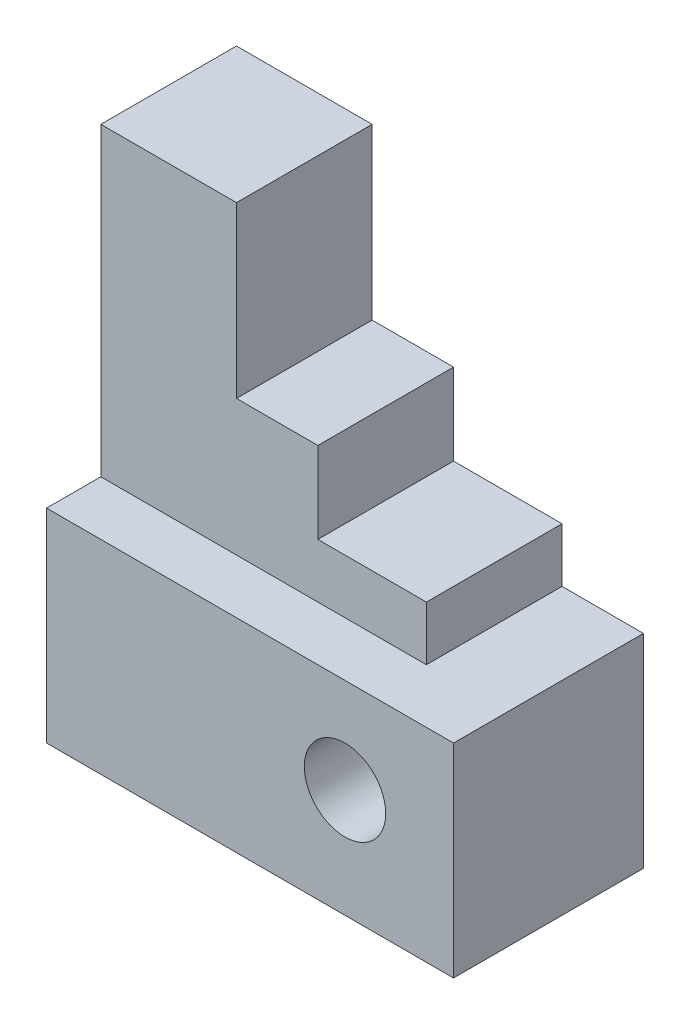
ISO-10303-21;
HEADER;
FILE_DESCRIPTION(('STEP AP214'),'2;1');
FILE_NAME('part.step','',(''),(''),'','','');
FILE_SCHEMA(('AUTOMOTIVE_DESIGN { 1 0 10303 214 1 1 1 1 }'));
ENDSEC;
DATA;
#1=APPLICATION_CONTEXT('core data for automotive mechanical design processes');
#2=APPLICATION_PROTOCOL_DEFINITION('international standard','automotive_design',2000,#1);
#3=PRODUCT_CONTEXT('',#1,'mechanical');
#4=PRODUCT('Part','Part','',(#3));
#5=PRODUCT_RELATED_PRODUCT_CATEGORY('part','',(#4));
#6=PRODUCT_DEFINITION_FORMATION('','',#4);
#7=PRODUCT_DEFINITION_CONTEXT('part definition',#1,'design');
#8=PRODUCT_DEFINITION('design','',#6,#7);
#9=PRODUCT_DEFINITION_SHAPE('','',#8);
#10=(LENGTH_UNIT() NAMED_UNIT(*) SI_UNIT(.MILLI.,.METRE.));
#11=(NAMED_UNIT(*) PLANE_ANGLE_UNIT() SI_UNIT($,.RADIAN.));
#12=(NAMED_UNIT(*) SI_UNIT($,.STERADIAN.) SOLID_ANGLE_UNIT());
#13=UNCERTAINTY_MEASURE_WITH_UNIT(LENGTH_MEASURE(1.E-05),#10,'distance_accuracy_value','');
#14=(GEOMETRIC_REPRESENTATION_CONTEXT(3) GLOBAL_UNCERTAINTY_ASSIGNED_CONTEXT((#13)) GLOBAL_UNIT_ASSIGNED_CONTEXT((#10,
#11,#12)) REPRESENTATION_CONTEXT('',''));
#15=CARTESIAN_POINT('',(0.,0.,0.));
#16=DIRECTION('',(0.,0.,1.));
#17=DIRECTION('',(1.,0.,0.));
#18=AXIS2_PLACEMENT_3D('',#15,#16,#17);
#19=CARTESIAN_POINT('',(0.,30.,0.));
#20=DIRECTION('',(0.,1.,0.));
#21=DIRECTION('',(0.,0.,1.));
#22=AXIS2_PLACEMENT_3D('',#19,#20,#21);
#23=PLANE('',#22);
#24=DIRECTION('',(-1.,0.,0.));
#25=VECTOR('',#24,1.);
#26=CARTESIAN_POINT('',(-30.,30.,-14.));
#27=LINE('',#26,#25);
#28=CARTESIAN_POINT('',(30.,30.,-14.));
#29=VERTEX_POINT('',#28);
#30=CARTESIAN_POINT('',(18.,30.,-14.));
#31=VERTEX_POINT('',#30);
#32=EDGE_CURVE('E197',#29,#31,#27,.T.);
#33=ORIENTED_EDGE('',*,*,#32,.T.);
#34=DIRECTION('',(0.,0.,1.));
#35=VECTOR('',#34,1.);
#36=CARTESIAN_POINT('',(18.,30.,-14.));
#37=LINE('',#36,#35);
#38=CARTESIAN_POINT('',(18.,30.,6.));
#39=VERTEX_POINT('',#38);
#40=EDGE_CURVE('E172',#31,#39,#37,.T.);
#41=ORIENTED_EDGE('',*,*,#40,.T.);
#42=DIRECTION('',(1.,0.,0.));
#43=VECTOR('',#42,1.);
#44=CARTESIAN_POINT('',(-30.,30.,6.));
#45=LINE('',#44,#43);
#46=CARTESIAN_POINT('',(-30.,30.,6.));
#47=VERTEX_POINT('',#46);
#48=EDGE_CURVE('E176',#47,#39,#45,.T.);
#49=ORIENTED_EDGE('',*,*,#48,.F.);
#50=DIRECTION('',(0.,0.,1.));
#51=VECTOR('',#50,1.);
#52=CARTESIAN_POINT('',(-30.,30.,-14.));
#53=LINE('',#52,#51);
#54=CARTESIAN_POINT('',(-30.,30.,14.));
#55=VERTEX_POINT('',#54);
#56=EDGE_CURVE('E200',#47,#55,#53,.T.);
#57=ORIENTED_EDGE('',*,*,#56,.T.);
#58=DIRECTION('',(1.,0.,0.));
#59=VECTOR('',#58,1.);
#60=CARTESIAN_POINT('',(-30.,30.,14.));
#61=LINE('',#60,#59);
#62=CARTESIAN_POINT('',(30.,30.,14.));
#63=VERTEX_POINT('',#62);
#64=EDGE_CURVE('E202',#55,#63,#61,.T.);
#65=ORIENTED_EDGE('',*,*,#64,.T.);
#66=DIRECTION('',(0.,0.,-1.));
#67=VECTOR('',#66,1.);
#68=CARTESIAN_POINT('',(30.,30.,-14.));
#69=LINE('',#68,#67);
#70=EDGE_CURVE('E194',#63,#29,#69,.T.);
#71=ORIENTED_EDGE('',*,*,#70,.T.);
#72=EDGE_LOOP('',(#33,#41,#49,#57,#65,#71));
#73=FACE_BOUND('',#72,.T.);
#74=ADVANCED_FACE('F45',(#73),#23,.T.);
#75=CARTESIAN_POINT('',(30.,30.,-14.));
#76=DIRECTION('',(-1.,0.,0.));
#77=DIRECTION('',(0.,0.,1.));
#78=AXIS2_PLACEMENT_3D('',#75,#76,#77);
#79=PLANE('',#78);
#80=DIRECTION('',(0.,0.,-1.));
#81=VECTOR('',#80,1.);
#82=CARTESIAN_POINT('',(30.,0.,-14.));
#83=LINE('',#82,#81);
#84=CARTESIAN_POINT('',(30.,0.,14.));
#85=VERTEX_POINT('',#84);
#86=CARTESIAN_POINT('',(30.,0.,-14.));
#87=VERTEX_POINT('',#86);
#88=EDGE_CURVE('E188',#85,#87,#83,.T.);
#89=ORIENTED_EDGE('',*,*,#88,.T.);
#90=DIRECTION('',(0.,-1.,0.));
#91=VECTOR('',#90,1.);
#92=CARTESIAN_POINT('',(30.,30.,-14.));
#93=LINE('',#92,#91);
#94=EDGE_CURVE('E218',#29,#87,#93,.T.);
#95=ORIENTED_EDGE('',*,*,#94,.F.);
#96=ORIENTED_EDGE('',*,*,#70,.F.);
#97=DIRECTION('',(0.,-1.,0.));
#98=VECTOR('',#97,1.);
#99=CARTESIAN_POINT('',(30.,30.,14.));
#100=LINE('',#99,#98);
#101=EDGE_CURVE('E204',#63,#85,#100,.T.);
#102=ORIENTED_EDGE('',*,*,#101,.T.);
#103=EDGE_LOOP('',(#89,#95,#96,#102));
#104=FACE_BOUND('',#103,.T.);
#105=ADVANCED_FACE('F47',(#104),#79,.F.);
#106=CARTESIAN_POINT('',(-30.,30.,-14.));
#107=DIRECTION('',(0.,0.,1.));
#108=DIRECTION('',(1.,0.,0.));
#109=AXIS2_PLACEMENT_3D('',#106,#107,#108);
#110=PLANE('',#109);
#111=CARTESIAN_POINT('',(14.,16.,-14.));
#112=DIRECTION('',(0.,0.,1.));
#113=DIRECTION('',(1.,0.,0.));
#114=AXIS2_PLACEMENT_3D('',#111,#112,#113);
#115=CIRCLE('',#114,6.);
#116=CARTESIAN_POINT('',(20.,16.,-14.));
#117=VERTEX_POINT('',#116);
#118=EDGE_CURVE('E153',#117,#117,#115,.T.);
#119=ORIENTED_EDGE('',*,*,#118,.T.);
#120=EDGE_LOOP('',(#119));
#121=FACE_BOUND('',#120,.T.);
#122=DIRECTION('',(0.,-1.,0.));
#123=VECTOR('',#122,1.);
#124=CARTESIAN_POINT('',(-10.,75.,-14.));
#125=LINE('',#124,#123);
#126=CARTESIAN_POINT('',(-10.,75.,-14.));
#127=VERTEX_POINT('',#126);
#128=CARTESIAN_POINT('',(-10.,50.,-14.));
#129=VERTEX_POINT('',#128);
#130=EDGE_CURVE('E130',#127,#129,#125,.T.);
#131=ORIENTED_EDGE('',*,*,#130,.T.);
#132=DIRECTION('',(-1.,0.,0.));
#133=VECTOR('',#132,1.);
#134=CARTESIAN_POINT('',(0.,50.,-14.));
#135=LINE('',#134,#133);
#136=CARTESIAN_POINT('',(2.,50.,-14.));
#137=VERTEX_POINT('',#136);
#138=EDGE_CURVE('E60',#137,#129,#135,.T.);
#139=ORIENTED_EDGE('',*,*,#138,.F.);
#140=DIRECTION('',(0.,-1.,0.));
#141=VECTOR('',#140,1.);
#142=CARTESIAN_POINT('',(2.,50.,-14.));
#143=LINE('',#142,#141);
#144=CARTESIAN_POINT('',(2.,38.,-14.));
#145=VERTEX_POINT('',#144);
#146=EDGE_CURVE('E168',#137,#145,#143,.T.);
#147=ORIENTED_EDGE('',*,*,#146,.T.);
#148=DIRECTION('',(1.,0.,0.));
#149=VECTOR('',#148,1.);
#150=CARTESIAN_POINT('',(-30.,38.,-14.));
#151=LINE('',#150,#149);
#152=CARTESIAN_POINT('',(18.,38.,-14.));
#153=VERTEX_POINT('',#152);
#154=EDGE_CURVE('E173',#145,#153,#151,.T.);
#155=ORIENTED_EDGE('',*,*,#154,.T.);
#156=DIRECTION('',(0.,-1.,0.));
#157=VECTOR('',#156,1.);
#158=CARTESIAN_POINT('',(18.,38.,-14.));
#159=LINE('',#158,#157);
#160=EDGE_CURVE('E181',#153,#31,#159,.T.);
#161=ORIENTED_EDGE('',*,*,#160,.T.);
#162=ORIENTED_EDGE('',*,*,#32,.F.);
#163=ORIENTED_EDGE('',*,*,#94,.T.);
#164=DIRECTION('',(-1.,0.,0.));
#165=VECTOR('',#164,1.);
#166=CARTESIAN_POINT('',(-30.,0.,-14.));
#167=LINE('',#166,#165);
#168=CARTESIAN_POINT('',(-30.,0.,-14.));
#169=VERTEX_POINT('',#168);
#170=EDGE_CURVE('E207',#87,#169,#167,.T.);
#171=ORIENTED_EDGE('',*,*,#170,.T.);
#172=DIRECTION('',(0.,-1.,0.));
#173=VECTOR('',#172,1.);
#174=CARTESIAN_POINT('',(-30.,30.,-14.));
#175=LINE('',#174,#173);
#176=CARTESIAN_POINT('',(-30.,75.,-14.));
#177=VERTEX_POINT('',#176);
#178=EDGE_CURVE('E143',#177,#169,#175,.T.);
#179=ORIENTED_EDGE('',*,*,#178,.F.);
#180=DIRECTION('',(-1.,0.,0.));
#181=VECTOR('',#180,1.);
#182=CARTESIAN_POINT('',(0.,75.,-14.));
#183=LINE('',#182,#181);
#184=EDGE_CURVE('E140',#127,#177,#183,.T.);
#185=ORIENTED_EDGE('',*,*,#184,.F.);
#186=EDGE_LOOP('',(#131,#139,#147,#155,#161,#162,#163,#171,#179,#185));
#187=FACE_BOUND('',#186,.T.);
#188=ADVANCED_FACE('F141',(#121,#187),#110,.F.);
#189=CARTESIAN_POINT('',(-30.,30.,-14.));
#190=DIRECTION('',(1.,0.,0.));
#191=DIRECTION('',(0.,0.,-1.));
#192=AXIS2_PLACEMENT_3D('',#189,#190,#191);
#193=PLANE('',#192);
#194=ORIENTED_EDGE('',*,*,#178,.T.);
#195=DIRECTION('',(0.,0.,1.));
#196=VECTOR('',#195,1.);
#197=CARTESIAN_POINT('',(-30.,0.,-14.));
#198=LINE('',#197,#196);
#199=CARTESIAN_POINT('',(-30.,0.,14.));
#200=VERTEX_POINT('',#199);
#201=EDGE_CURVE('E209',#169,#200,#198,.T.);
#202=ORIENTED_EDGE('',*,*,#201,.T.);
#203=DIRECTION('',(0.,-1.,0.));
#204=VECTOR('',#203,1.);
#205=CARTESIAN_POINT('',(-30.,30.,14.));
#206=LINE('',#205,#204);
#207=EDGE_CURVE('E214',#55,#200,#206,.T.);
#208=ORIENTED_EDGE('',*,*,#207,.F.);
#209=ORIENTED_EDGE('',*,*,#56,.F.);
#210=DIRECTION('',(0.,-1.,0.));
#211=VECTOR('',#210,1.);
#212=CARTESIAN_POINT('',(-30.,38.,6.));
#213=LINE('',#212,#211);
#214=CARTESIAN_POINT('',(-30.,75.,6.));
#215=VERTEX_POINT('',#214);
#216=EDGE_CURVE('E185',#215,#47,#213,.T.);
#217=ORIENTED_EDGE('',*,*,#216,.F.);
#218=DIRECTION('',(0.,0.,1.));
#219=VECTOR('',#218,1.);
#220=CARTESIAN_POINT('',(-30.,75.,0.));
#221=LINE('',#220,#219);
#222=EDGE_CURVE('E147',#177,#215,#221,.T.);
#223=ORIENTED_EDGE('',*,*,#222,.F.);
#224=EDGE_LOOP('',(#194,#202,#208,#209,#217,#223));
#225=FACE_BOUND('',#224,.T.);
#226=ADVANCED_FACE('F236',(#225),#193,.F.);
#227=CARTESIAN_POINT('',(-30.,30.,14.));
#228=DIRECTION('',(0.,0.,-1.));
#229=DIRECTION('',(-1.,0.,0.));
#230=AXIS2_PLACEMENT_3D('',#227,#228,#229);
#231=PLANE('',#230);
#232=CARTESIAN_POINT('',(14.,16.,14.));
#233=DIRECTION('',(0.,0.,1.));
#234=DIRECTION('',(1.,0.,0.));
#235=AXIS2_PLACEMENT_3D('',#232,#233,#234);
#236=CIRCLE('',#235,6.);
#237=CARTESIAN_POINT('',(20.,16.,14.));
#238=VERTEX_POINT('',#237);
#239=EDGE_CURVE('E156',#238,#238,#236,.T.);
#240=ORIENTED_EDGE('',*,*,#239,.F.);
#241=EDGE_LOOP('',(#240));
#242=FACE_BOUND('',#241,.T.);
#243=DIRECTION('',(1.,0.,0.));
#244=VECTOR('',#243,1.);
#245=CARTESIAN_POINT('',(-30.,0.,14.));
#246=LINE('',#245,#244);
#247=EDGE_CURVE('E198',#200,#85,#246,.T.);
#248=ORIENTED_EDGE('',*,*,#247,.T.);
#249=ORIENTED_EDGE('',*,*,#101,.F.);
#250=ORIENTED_EDGE('',*,*,#64,.F.);
#251=ORIENTED_EDGE('',*,*,#207,.T.);
#252=EDGE_LOOP('',(#248,#249,#250,#251));
#253=FACE_BOUND('',#252,.T.);
#254=ADVANCED_FACE('F250',(#242,#253),#231,.F.);
#255=CARTESIAN_POINT('',(0.,0.,0.));
#256=DIRECTION('',(0.,1.,0.));
#257=DIRECTION('',(0.,0.,1.));
#258=AXIS2_PLACEMENT_3D('',#255,#256,#257);
#259=PLANE('',#258);
#260=ORIENTED_EDGE('',*,*,#88,.F.);
#261=ORIENTED_EDGE('',*,*,#247,.F.);
#262=ORIENTED_EDGE('',*,*,#201,.F.);
#263=ORIENTED_EDGE('',*,*,#170,.F.);
#264=EDGE_LOOP('',(#260,#261,#262,#263));
#265=FACE_BOUND('',#264,.T.);
#266=ADVANCED_FACE('F248',(#265),#259,.F.);
#267=CARTESIAN_POINT('',(-30.,38.,6.));
#268=DIRECTION('',(0.,0.,-1.));
#269=DIRECTION('',(-1.,0.,0.));
#270=AXIS2_PLACEMENT_3D('',#267,#268,#269);
#271=PLANE('',#270);
#272=DIRECTION('',(1.,0.,0.));
#273=VECTOR('',#272,1.);
#274=CARTESIAN_POINT('',(0.,50.,6.));
#275=LINE('',#274,#273);
#276=CARTESIAN_POINT('',(-9.99999999999999,50.,6.));
#277=VERTEX_POINT('',#276);
#278=CARTESIAN_POINT('',(2.00000000000001,50.,6.));
#279=VERTEX_POINT('',#278);
#280=EDGE_CURVE('E164',#277,#279,#275,.T.);
#281=ORIENTED_EDGE('',*,*,#280,.F.);
#282=DIRECTION('',(0.,-1.,0.));
#283=VECTOR('',#282,1.);
#284=CARTESIAN_POINT('',(-9.99999999999999,75.,6.));
#285=LINE('',#284,#283);
#286=CARTESIAN_POINT('',(-9.99999999999999,75.,6.));
#287=VERTEX_POINT('',#286);
#288=EDGE_CURVE('E137',#287,#277,#285,.T.);
#289=ORIENTED_EDGE('',*,*,#288,.F.);
#290=DIRECTION('',(1.,0.,0.));
#291=VECTOR('',#290,1.);
#292=CARTESIAN_POINT('',(0.,75.,6.));
#293=LINE('',#292,#291);
#294=EDGE_CURVE('E151',#215,#287,#293,.T.);
#295=ORIENTED_EDGE('',*,*,#294,.F.);
#296=ORIENTED_EDGE('',*,*,#216,.T.);
#297=ORIENTED_EDGE('',*,*,#48,.T.);
#298=DIRECTION('',(0.,-1.,0.));
#299=VECTOR('',#298,1.);
#300=CARTESIAN_POINT('',(18.,38.,6.));
#301=LINE('',#300,#299);
#302=CARTESIAN_POINT('',(18.,38.,6.));
#303=VERTEX_POINT('',#302);
#304=EDGE_CURVE('E189',#303,#39,#301,.T.);
#305=ORIENTED_EDGE('',*,*,#304,.F.);
#306=DIRECTION('',(1.,0.,0.));
#307=VECTOR('',#306,1.);
#308=CARTESIAN_POINT('',(-30.,38.,6.));
#309=LINE('',#308,#307);
#310=CARTESIAN_POINT('',(2.,38.,6.));
#311=VERTEX_POINT('',#310);
#312=EDGE_CURVE('E179',#311,#303,#309,.T.);
#313=ORIENTED_EDGE('',*,*,#312,.F.);
#314=DIRECTION('',(0.,-1.,0.));
#315=VECTOR('',#314,1.);
#316=CARTESIAN_POINT('',(2.00000000000001,50.,6.));
#317=LINE('',#316,#315);
#318=EDGE_CURVE('E67',#279,#311,#317,.T.);
#319=ORIENTED_EDGE('',*,*,#318,.F.);
#320=EDGE_LOOP('',(#281,#289,#295,#296,#297,#305,#313,#319));
#321=FACE_BOUND('',#320,.T.);
#322=ADVANCED_FACE('F227',(#321),#271,.F.);
#323=CARTESIAN_POINT('',(18.,38.,-14.));
#324=DIRECTION('',(1.,0.,0.));
#325=DIRECTION('',(0.,0.,-1.));
#326=AXIS2_PLACEMENT_3D('',#323,#324,#325);
#327=PLANE('',#326);
#328=ORIENTED_EDGE('',*,*,#40,.F.);
#329=ORIENTED_EDGE('',*,*,#160,.F.);
#330=DIRECTION('',(0.,0.,1.));
#331=VECTOR('',#330,1.);
#332=CARTESIAN_POINT('',(18.,38.,-14.));
#333=LINE('',#332,#331);
#334=EDGE_CURVE('E175',#153,#303,#333,.T.);
#335=ORIENTED_EDGE('',*,*,#334,.T.);
#336=ORIENTED_EDGE('',*,*,#304,.T.);
#337=EDGE_LOOP('',(#328,#329,#335,#336));
#338=FACE_BOUND('',#337,.T.);
#339=ADVANCED_FACE('F231',(#338),#327,.T.);
#340=CARTESIAN_POINT('',(0.,38.,0.));
#341=DIRECTION('',(0.,-1.,0.));
#342=DIRECTION('',(0.,0.,-1.));
#343=AXIS2_PLACEMENT_3D('',#340,#341,#342);
#344=PLANE('',#343);
#345=ORIENTED_EDGE('',*,*,#154,.F.);
#346=DIRECTION('',(0.,0.,1.));
#347=VECTOR('',#346,1.);
#348=CARTESIAN_POINT('',(2.,38.,0.));
#349=LINE('',#348,#347);
#350=EDGE_CURVE('E53',#145,#311,#349,.T.);
#351=ORIENTED_EDGE('',*,*,#350,.T.);
#352=ORIENTED_EDGE('',*,*,#312,.T.);
#353=ORIENTED_EDGE('',*,*,#334,.F.);
#354=EDGE_LOOP('',(#345,#351,#352,#353));
#355=FACE_BOUND('',#354,.T.);
#356=ADVANCED_FACE('F223',(#355),#344,.F.);
#357=CARTESIAN_POINT('',(2.,50.,0.));
#358=DIRECTION('',(1.,0.,0.));
#359=DIRECTION('',(0.,0.,-1.));
#360=AXIS2_PLACEMENT_3D('',#357,#358,#359);
#361=PLANE('',#360);
#362=ORIENTED_EDGE('',*,*,#350,.F.);
#363=ORIENTED_EDGE('',*,*,#146,.F.);
#364=DIRECTION('',(0.,0.,1.));
#365=VECTOR('',#364,1.);
#366=CARTESIAN_POINT('',(2.,50.,0.));
#367=LINE('',#366,#365);
#368=EDGE_CURVE('E166',#137,#279,#367,.T.);
#369=ORIENTED_EDGE('',*,*,#368,.T.);
#370=ORIENTED_EDGE('',*,*,#318,.T.);
#371=EDGE_LOOP('',(#362,#363,#369,#370));
#372=FACE_BOUND('',#371,.T.);
#373=ADVANCED_FACE('F232',(#372),#361,.T.);
#374=CARTESIAN_POINT('',(0.,50.,0.));
#375=DIRECTION('',(0.,1.,0.));
#376=DIRECTION('',(0.,0.,1.));
#377=AXIS2_PLACEMENT_3D('',#374,#375,#376);
#378=PLANE('',#377);
#379=DIRECTION('',(0.,0.,-1.));
#380=VECTOR('',#379,1.);
#381=CARTESIAN_POINT('',(-10.,50.,0.));
#382=LINE('',#381,#380);
#383=EDGE_CURVE('E11',#277,#129,#382,.T.);
#384=ORIENTED_EDGE('',*,*,#383,.F.);
#385=ORIENTED_EDGE('',*,*,#280,.T.);
#386=ORIENTED_EDGE('',*,*,#368,.F.);
#387=ORIENTED_EDGE('',*,*,#138,.T.);
#388=EDGE_LOOP('',(#384,#385,#386,#387));
#389=FACE_BOUND('',#388,.T.);
#390=ADVANCED_FACE('F233',(#389),#378,.T.);
#391=CARTESIAN_POINT('',(-10.,75.,0.));
#392=DIRECTION('',(1.,0.,0.));
#393=DIRECTION('',(0.,0.,-1.));
#394=AXIS2_PLACEMENT_3D('',#391,#392,#393);
#395=PLANE('',#394);
#396=ORIENTED_EDGE('',*,*,#288,.T.);
#397=ORIENTED_EDGE('',*,*,#383,.T.);
#398=ORIENTED_EDGE('',*,*,#130,.F.);
#399=DIRECTION('',(0.,0.,1.));
#400=VECTOR('',#399,1.);
#401=CARTESIAN_POINT('',(-10.,75.,0.));
#402=LINE('',#401,#400);
#403=EDGE_CURVE('E135',#127,#287,#402,.T.);
#404=ORIENTED_EDGE('',*,*,#403,.T.);
#405=EDGE_LOOP('',(#396,#397,#398,#404));
#406=FACE_BOUND('',#405,.T.);
#407=ADVANCED_FACE('F133',(#406),#395,.T.);
#408=CARTESIAN_POINT('',(0.,75.,0.));
#409=DIRECTION('',(0.,1.,0.));
#410=DIRECTION('',(0.,0.,1.));
#411=AXIS2_PLACEMENT_3D('',#408,#409,#410);
#412=PLANE('',#411);
#413=ORIENTED_EDGE('',*,*,#403,.F.);
#414=ORIENTED_EDGE('',*,*,#184,.T.);
#415=ORIENTED_EDGE('',*,*,#222,.T.);
#416=ORIENTED_EDGE('',*,*,#294,.T.);
#417=EDGE_LOOP('',(#413,#414,#415,#416));
#418=FACE_BOUND('',#417,.T.);
#419=ADVANCED_FACE('F149',(#418),#412,.T.);
#420=CARTESIAN_POINT('',(14.,16.,-14.));
#421=DIRECTION('',(0.,0.,1.));
#422=DIRECTION('',(1.,0.,0.));
#423=AXIS2_PLACEMENT_3D('',#420,#421,#422);
#424=CYLINDRICAL_SURFACE('',#423,6.);
#425=ORIENTED_EDGE('',*,*,#118,.F.);
#426=EDGE_LOOP('',(#425));
#427=FACE_BOUND('',#426,.T.);
#428=ORIENTED_EDGE('',*,*,#239,.T.);
#429=EDGE_LOOP('',(#428));
#430=FACE_BOUND('',#429,.T.);
#431=ADVANCED_FACE('F283',(#427,#430),#424,.F.);
#432=CLOSED_SHELL('',(#74,#105,#188,#226,#254,#266,#322,#339,#356,#373,#390,#407,#419,#431));
#433=MANIFOLD_SOLID_BREP('B2',#432);
#434=ADVANCED_BREP_SHAPE_REPRESENTATION('',(#18,#433),#14);
#435=SHAPE_DEFINITION_REPRESENTATION(#9,#434);
ENDSEC;
END-ISO-10303-21;
